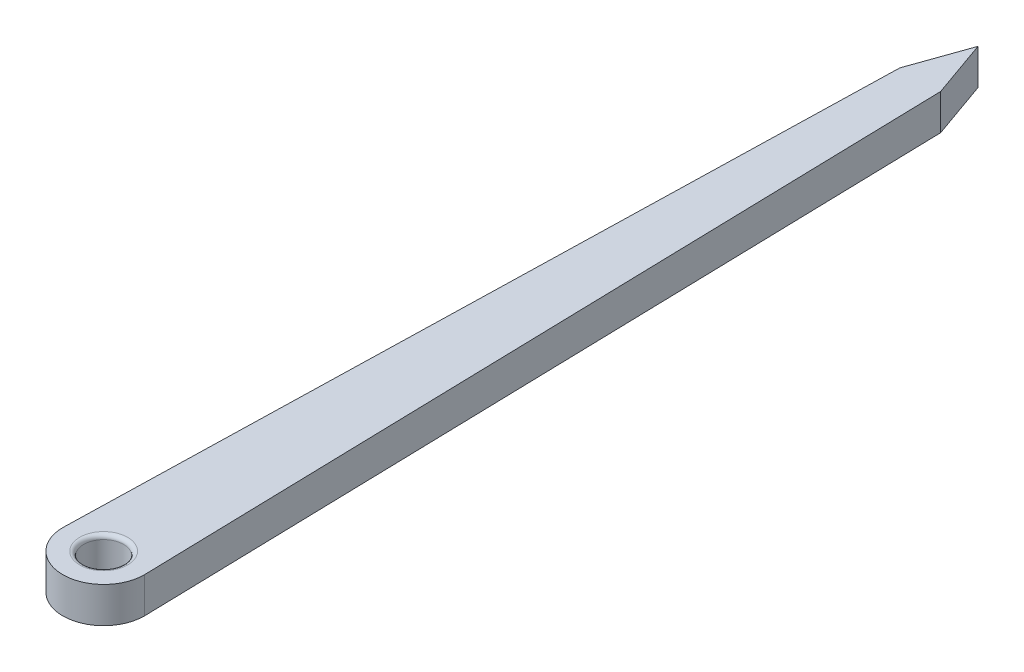
ISO-10303-21;
HEADER;
FILE_DESCRIPTION(('STEP AP214'),'2;1');
FILE_NAME('part.step','',(''),(''),'','','');
FILE_SCHEMA(('AUTOMOTIVE_DESIGN { 1 0 10303 214 1 1 1 1 }'));
ENDSEC;
DATA;
#1=APPLICATION_CONTEXT('core data for automotive mechanical design processes');
#2=APPLICATION_PROTOCOL_DEFINITION('international standard','automotive_design',2000,#1);
#3=PRODUCT_CONTEXT('',#1,'mechanical');
#4=PRODUCT('Part','Part','',(#3));
#5=PRODUCT_RELATED_PRODUCT_CATEGORY('part','',(#4));
#6=PRODUCT_DEFINITION_FORMATION('','',#4);
#7=PRODUCT_DEFINITION_CONTEXT('part definition',#1,'design');
#8=PRODUCT_DEFINITION('design','',#6,#7);
#9=PRODUCT_DEFINITION_SHAPE('','',#8);
#10=(LENGTH_UNIT() NAMED_UNIT(*) SI_UNIT(.MILLI.,.METRE.));
#11=(NAMED_UNIT(*) PLANE_ANGLE_UNIT() SI_UNIT($,.RADIAN.));
#12=(NAMED_UNIT(*) SI_UNIT($,.STERADIAN.) SOLID_ANGLE_UNIT());
#13=UNCERTAINTY_MEASURE_WITH_UNIT(LENGTH_MEASURE(1.E-05),#10,'distance_accuracy_value','');
#14=(GEOMETRIC_REPRESENTATION_CONTEXT(3) GLOBAL_UNCERTAINTY_ASSIGNED_CONTEXT((#13)) GLOBAL_UNIT_ASSIGNED_CONTEXT((#10,
#11,#12)) REPRESENTATION_CONTEXT('',''));
#15=CARTESIAN_POINT('',(0.,0.,0.));
#16=DIRECTION('',(0.,0.,1.));
#17=DIRECTION('',(1.,0.,0.));
#18=AXIS2_PLACEMENT_3D('',#15,#16,#17);
#19=CARTESIAN_POINT('',(-3.99750156152405,3.5,-0.0999375390381017));
#20=DIRECTION('',(-0.999687646408123,0.,-0.0249921911602032));
#21=DIRECTION('',(-0.0249921911602032,0.,0.999687646408123));
#22=AXIS2_PLACEMENT_3D('',#19,#20,#21);
#23=PLANE('',#22);
#24=DIRECTION('',(0.0249921911602032,0.,-0.999687646408123));
#25=VECTOR('',#24,1.);
#26=CARTESIAN_POINT('',(-3.99750156152405,0.,-0.0999375390381017));
#27=LINE('',#26,#25);
#28=CARTESIAN_POINT('',(-4.,0.,0.));
#29=VERTEX_POINT('',#28);
#30=CARTESIAN_POINT('',(-1.99999999999999,0.,-80.));
#31=VERTEX_POINT('',#30);
#32=EDGE_CURVE('E112',#29,#31,#27,.T.);
#33=ORIENTED_EDGE('',*,*,#32,.F.);
#34=DIRECTION('',(0.,-1.,0.));
#35=VECTOR('',#34,1.);
#36=CARTESIAN_POINT('',(-4.,3.5,0.));
#37=LINE('',#36,#35);
#38=CARTESIAN_POINT('',(-4.,3.5,0.));
#39=VERTEX_POINT('',#38);
#40=EDGE_CURVE('E78',#39,#29,#37,.T.);
#41=ORIENTED_EDGE('',*,*,#40,.F.);
#42=DIRECTION('',(0.0249921911602032,0.,-0.999687646408123));
#43=VECTOR('',#42,1.);
#44=CARTESIAN_POINT('',(-3.99750156152405,3.5,-0.0999375390381017));
#45=LINE('',#44,#43);
#46=CARTESIAN_POINT('',(-1.99999999999999,3.5,-80.));
#47=VERTEX_POINT('',#46);
#48=EDGE_CURVE('E124',#39,#47,#45,.T.);
#49=ORIENTED_EDGE('',*,*,#48,.T.);
#50=DIRECTION('',(0.,-1.,0.));
#51=VECTOR('',#50,1.);
#52=CARTESIAN_POINT('',(-1.99999999999999,3.5,-80.));
#53=LINE('',#52,#51);
#54=EDGE_CURVE('E52',#47,#31,#53,.T.);
#55=ORIENTED_EDGE('',*,*,#54,.T.);
#56=EDGE_LOOP('',(#33,#41,#49,#55));
#57=FACE_BOUND('',#56,.T.);
#58=ADVANCED_FACE('F35',(#57),#23,.T.);
#59=CARTESIAN_POINT('',(0.,3.5,0.));
#60=DIRECTION('',(0.,-1.,0.));
#61=DIRECTION('',(0.,0.,-1.));
#62=AXIS2_PLACEMENT_3D('',#59,#60,#61);
#63=CYLINDRICAL_SURFACE('',#62,4.);
#64=CARTESIAN_POINT('',(0.,0.,0.));
#65=DIRECTION('',(0.,1.,0.));
#66=DIRECTION('',(0.,0.,1.));
#67=AXIS2_PLACEMENT_3D('',#64,#65,#66);
#68=CIRCLE('',#67,4.);
#69=CARTESIAN_POINT('',(4.,0.,0.));
#70=VERTEX_POINT('',#69);
#71=EDGE_CURVE('E114',#29,#70,#68,.T.);
#72=ORIENTED_EDGE('',*,*,#71,.T.);
#73=DIRECTION('',(0.,-1.,0.));
#74=VECTOR('',#73,1.);
#75=CARTESIAN_POINT('',(4.,3.5,0.));
#76=LINE('',#75,#74);
#77=CARTESIAN_POINT('',(4.,3.5,0.));
#78=VERTEX_POINT('',#77);
#79=EDGE_CURVE('E95',#78,#70,#76,.T.);
#80=ORIENTED_EDGE('',*,*,#79,.F.);
#81=CARTESIAN_POINT('',(0.,3.5,0.));
#82=DIRECTION('',(0.,1.,0.));
#83=DIRECTION('',(0.,0.,1.));
#84=AXIS2_PLACEMENT_3D('',#81,#82,#83);
#85=CIRCLE('',#84,4.);
#86=EDGE_CURVE('E103',#39,#78,#85,.T.);
#87=ORIENTED_EDGE('',*,*,#86,.F.);
#88=ORIENTED_EDGE('',*,*,#40,.T.);
#89=EDGE_LOOP('',(#72,#80,#87,#88));
#90=FACE_BOUND('',#89,.T.);
#91=ADVANCED_FACE('F145',(#90),#63,.T.);
#92=CARTESIAN_POINT('',(3.99750156152405,3.5,-0.0999375390381007));
#93=DIRECTION('',(0.999687646408123,0.,-0.0249921911602029));
#94=DIRECTION('',(-0.0249921911602029,0.,-0.999687646408123));
#95=AXIS2_PLACEMENT_3D('',#92,#93,#94);
#96=PLANE('',#95);
#97=DIRECTION('',(0.0249921911602029,0.,0.999687646408123));
#98=VECTOR('',#97,1.);
#99=CARTESIAN_POINT('',(3.99750156152405,0.,-0.0999375390381007));
#100=LINE('',#99,#98);
#101=CARTESIAN_POINT('',(2.00000000000001,0.,-80.));
#102=VERTEX_POINT('',#101);
#103=EDGE_CURVE('E91',#102,#70,#100,.T.);
#104=ORIENTED_EDGE('',*,*,#103,.F.);
#105=DIRECTION('',(0.,-1.,0.));
#106=VECTOR('',#105,1.);
#107=CARTESIAN_POINT('',(2.00000000000001,3.5,-80.));
#108=LINE('',#107,#106);
#109=CARTESIAN_POINT('',(2.00000000000001,3.5,-80.));
#110=VERTEX_POINT('',#109);
#111=EDGE_CURVE('E86',#110,#102,#108,.T.);
#112=ORIENTED_EDGE('',*,*,#111,.F.);
#113=DIRECTION('',(0.0249921911602029,0.,0.999687646408123));
#114=VECTOR('',#113,1.);
#115=CARTESIAN_POINT('',(3.99750156152405,3.5,-0.0999375390381007));
#116=LINE('',#115,#114);
#117=EDGE_CURVE('E89',#110,#78,#116,.T.);
#118=ORIENTED_EDGE('',*,*,#117,.T.);
#119=ORIENTED_EDGE('',*,*,#79,.T.);
#120=EDGE_LOOP('',(#104,#112,#118,#119));
#121=FACE_BOUND('',#120,.T.);
#122=ADVANCED_FACE('F88',(#121),#96,.T.);
#123=CARTESIAN_POINT('',(26.9193522199662,3.5,-9.51742824994362));
#124=DIRECTION('',(0.942809041582063,0.,-0.333333333333334));
#125=DIRECTION('',(-0.333333333333334,0.,-0.942809041582063));
#126=AXIS2_PLACEMENT_3D('',#123,#124,#125);
#127=PLANE('',#126);
#128=DIRECTION('',(0.333333333333334,0.,0.942809041582063));
#129=VECTOR('',#128,1.);
#130=CARTESIAN_POINT('',(26.9193522199662,0.,-9.51742824994362));
#131=LINE('',#130,#129);
#132=CARTESIAN_POINT('',(0.,0.,-85.6568542494924));
#133=VERTEX_POINT('',#132);
#134=EDGE_CURVE('E119',#133,#102,#131,.T.);
#135=ORIENTED_EDGE('',*,*,#134,.F.);
#136=DIRECTION('',(0.,-1.,0.));
#137=VECTOR('',#136,1.);
#138=CARTESIAN_POINT('',(0.,3.5,-85.6568542494924));
#139=LINE('',#138,#137);
#140=CARTESIAN_POINT('',(0.,3.5,-85.6568542494924));
#141=VERTEX_POINT('',#140);
#142=EDGE_CURVE('E69',#141,#133,#139,.T.);
#143=ORIENTED_EDGE('',*,*,#142,.F.);
#144=DIRECTION('',(0.333333333333334,0.,0.942809041582063));
#145=VECTOR('',#144,1.);
#146=CARTESIAN_POINT('',(26.9193522199662,3.5,-9.51742824994362));
#147=LINE('',#146,#145);
#148=EDGE_CURVE('E102',#141,#110,#147,.T.);
#149=ORIENTED_EDGE('',*,*,#148,.T.);
#150=ORIENTED_EDGE('',*,*,#111,.T.);
#151=EDGE_LOOP('',(#135,#143,#149,#150));
#152=FACE_BOUND('',#151,.T.);
#153=ADVANCED_FACE('F106',(#152),#127,.T.);
#154=CARTESIAN_POINT('',(-26.9193522199661,3.5,-9.51742824994361));
#155=DIRECTION('',(-0.942809041582063,0.,-0.333333333333334));
#156=DIRECTION('',(-0.333333333333334,0.,0.942809041582063));
#157=AXIS2_PLACEMENT_3D('',#154,#155,#156);
#158=PLANE('',#157);
#159=DIRECTION('',(0.333333333333334,0.,-0.942809041582063));
#160=VECTOR('',#159,1.);
#161=CARTESIAN_POINT('',(-26.9193522199661,0.,-9.51742824994361));
#162=LINE('',#161,#160);
#163=EDGE_CURVE('E121',#31,#133,#162,.T.);
#164=ORIENTED_EDGE('',*,*,#163,.F.);
#165=ORIENTED_EDGE('',*,*,#54,.F.);
#166=DIRECTION('',(0.333333333333334,0.,-0.942809041582063));
#167=VECTOR('',#166,1.);
#168=CARTESIAN_POINT('',(-26.9193522199661,3.5,-9.51742824994361));
#169=LINE('',#168,#167);
#170=EDGE_CURVE('E107',#47,#141,#169,.T.);
#171=ORIENTED_EDGE('',*,*,#170,.T.);
#172=ORIENTED_EDGE('',*,*,#142,.T.);
#173=EDGE_LOOP('',(#164,#165,#171,#172));
#174=FACE_BOUND('',#173,.T.);
#175=ADVANCED_FACE('F156',(#174),#158,.T.);
#176=CARTESIAN_POINT('',(0.,3.5,0.));
#177=DIRECTION('',(0.,1.,0.));
#178=DIRECTION('',(0.,0.,1.));
#179=AXIS2_PLACEMENT_3D('',#176,#177,#178);
#180=PLANE('',#179);
#181=CARTESIAN_POINT('',(0.,3.5,0.));
#182=DIRECTION('',(0.,1.,0.));
#183=DIRECTION('',(0.,0.,1.));
#184=AXIS2_PLACEMENT_3D('',#181,#182,#183);
#185=CIRCLE('',#184,2.35);
#186=CARTESIAN_POINT('',(0.,3.5,2.35));
#187=VERTEX_POINT('',#186);
#188=EDGE_CURVE('E11',#187,#187,#185,.F.);
#189=ORIENTED_EDGE('',*,*,#188,.T.);
#190=EDGE_LOOP('',(#189));
#191=FACE_BOUND('',#190,.T.);
#192=ORIENTED_EDGE('',*,*,#48,.F.);
#193=ORIENTED_EDGE('',*,*,#86,.T.);
#194=ORIENTED_EDGE('',*,*,#117,.F.);
#195=ORIENTED_EDGE('',*,*,#148,.F.);
#196=ORIENTED_EDGE('',*,*,#170,.F.);
#197=EDGE_LOOP('',(#192,#193,#194,#195,#196));
#198=FACE_BOUND('',#197,.T.);
#199=ADVANCED_FACE('F100',(#191,#198),#180,.T.);
#200=CARTESIAN_POINT('',(0.,0.,0.));
#201=DIRECTION('',(0.,1.,0.));
#202=DIRECTION('',(0.,0.,1.));
#203=AXIS2_PLACEMENT_3D('',#200,#201,#202);
#204=PLANE('',#203);
#205=CARTESIAN_POINT('',(0.,0.,0.));
#206=DIRECTION('',(0.,1.,0.));
#207=DIRECTION('',(0.,0.,1.));
#208=AXIS2_PLACEMENT_3D('',#205,#206,#207);
#209=CIRCLE('',#208,1.95);
#210=CARTESIAN_POINT('',(0.,0.,1.95));
#211=VERTEX_POINT('',#210);
#212=EDGE_CURVE('E115',#211,#211,#209,.T.);
#213=ORIENTED_EDGE('',*,*,#212,.T.);
#214=EDGE_LOOP('',(#213));
#215=FACE_BOUND('',#214,.T.);
#216=ORIENTED_EDGE('',*,*,#32,.T.);
#217=ORIENTED_EDGE('',*,*,#163,.T.);
#218=ORIENTED_EDGE('',*,*,#134,.T.);
#219=ORIENTED_EDGE('',*,*,#103,.T.);
#220=ORIENTED_EDGE('',*,*,#71,.F.);
#221=EDGE_LOOP('',(#216,#217,#218,#219,#220));
#222=FACE_BOUND('',#221,.T.);
#223=ADVANCED_FACE('F141',(#215,#222),#204,.F.);
#224=CARTESIAN_POINT('',(0.,-96.5,0.));
#225=DIRECTION('',(0.,1.,0.));
#226=DIRECTION('',(0.,0.,1.));
#227=AXIS2_PLACEMENT_3D('',#224,#225,#226);
#228=CYLINDRICAL_SURFACE('',#227,1.95);
#229=CARTESIAN_POINT('',(0.,3.10000000000001,0.));
#230=DIRECTION('',(0.,1.,0.));
#231=DIRECTION('',(0.,0.,1.));
#232=AXIS2_PLACEMENT_3D('',#229,#230,#231);
#233=CIRCLE('',#232,1.95);
#234=CARTESIAN_POINT('',(0.,3.10000000000001,1.95));
#235=VERTEX_POINT('',#234);
#236=EDGE_CURVE('E44',#235,#235,#233,.T.);
#237=ORIENTED_EDGE('',*,*,#236,.T.);
#238=EDGE_LOOP('',(#237));
#239=FACE_BOUND('',#238,.T.);
#240=ORIENTED_EDGE('',*,*,#212,.F.);
#241=EDGE_LOOP('',(#240));
#242=FACE_BOUND('',#241,.T.);
#243=ADVANCED_FACE('F133',(#239,#242),#228,.F.);
#244=CARTESIAN_POINT('',(0.,3.10000000000001,0.));
#245=DIRECTION('',(0.,1.,0.));
#246=DIRECTION('',(0.,0.,1.));
#247=AXIS2_PLACEMENT_3D('',#244,#245,#246);
#248=TOROIDAL_SURFACE('',#247,2.35,0.4);
#249=ORIENTED_EDGE('',*,*,#188,.F.);
#250=EDGE_LOOP('',(#249));
#251=FACE_BOUND('',#250,.T.);
#252=ORIENTED_EDGE('',*,*,#236,.F.);
#253=EDGE_LOOP('',(#252));
#254=FACE_BOUND('',#253,.T.);
#255=ADVANCED_FACE('F37',(#251,#254),#248,.T.);
#256=CLOSED_SHELL('',(#58,#91,#122,#153,#175,#199,#223,#243,#255));
#257=MANIFOLD_SOLID_BREP('B2',#256);
#258=ADVANCED_BREP_SHAPE_REPRESENTATION('',(#18,#257),#14);
#259=SHAPE_DEFINITION_REPRESENTATION(#9,#258);
ENDSEC;
END-ISO-10303-21;
